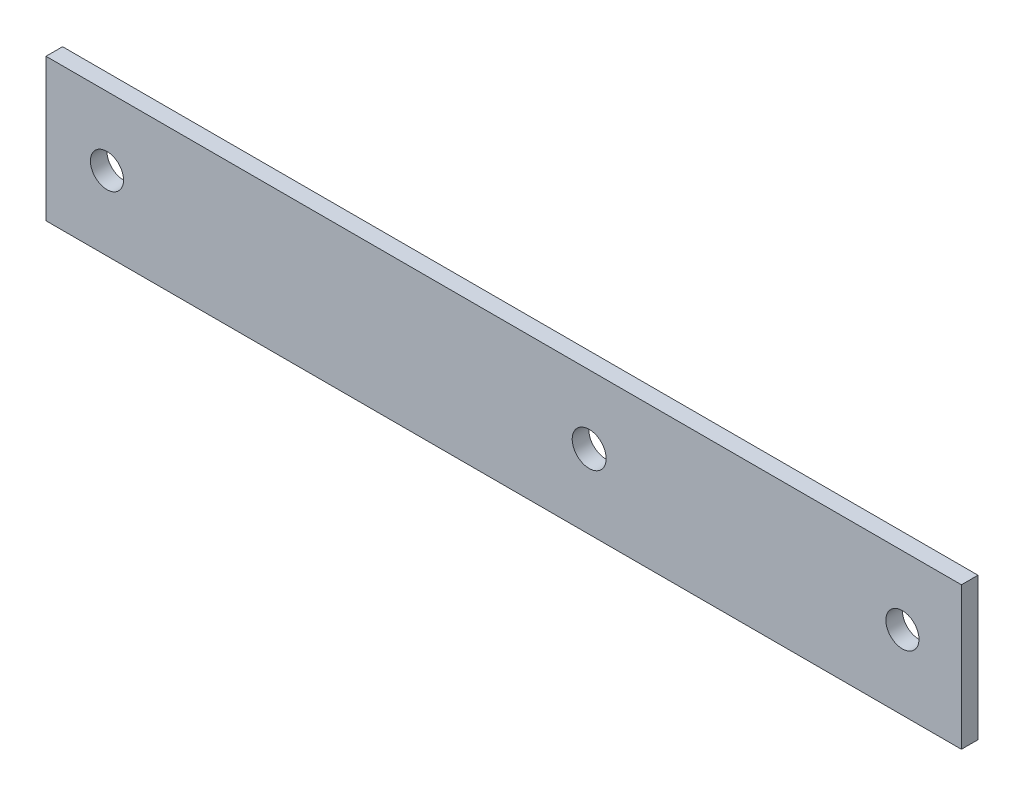
ISO-10303-21;
HEADER;
FILE_DESCRIPTION(('STEP AP214'),'2;1');
FILE_NAME('part.step','',(''),(''),'','','');
FILE_SCHEMA(('AUTOMOTIVE_DESIGN { 1 0 10303 214 1 1 1 1 }'));
ENDSEC;
DATA;
#1=APPLICATION_CONTEXT('core data for automotive mechanical design processes');
#2=APPLICATION_PROTOCOL_DEFINITION('international standard','automotive_design',2000,#1);
#3=PRODUCT_CONTEXT('',#1,'mechanical');
#4=PRODUCT('Part','Part','',(#3));
#5=PRODUCT_RELATED_PRODUCT_CATEGORY('part','',(#4));
#6=PRODUCT_DEFINITION_FORMATION('','',#4);
#7=PRODUCT_DEFINITION_CONTEXT('part definition',#1,'design');
#8=PRODUCT_DEFINITION('design','',#6,#7);
#9=PRODUCT_DEFINITION_SHAPE('','',#8);
#10=(LENGTH_UNIT() NAMED_UNIT(*) SI_UNIT(.MILLI.,.METRE.));
#11=(NAMED_UNIT(*) PLANE_ANGLE_UNIT() SI_UNIT($,.RADIAN.));
#12=(NAMED_UNIT(*) SI_UNIT($,.STERADIAN.) SOLID_ANGLE_UNIT());
#13=UNCERTAINTY_MEASURE_WITH_UNIT(LENGTH_MEASURE(1.E-05),#10,'distance_accuracy_value','');
#14=(GEOMETRIC_REPRESENTATION_CONTEXT(3) GLOBAL_UNCERTAINTY_ASSIGNED_CONTEXT((#13)) GLOBAL_UNIT_ASSIGNED_CONTEXT((#10,
#11,#12)) REPRESENTATION_CONTEXT('',''));
#15=CARTESIAN_POINT('',(0.,0.,0.));
#16=DIRECTION('',(0.,0.,1.));
#17=DIRECTION('',(1.,0.,0.));
#18=AXIS2_PLACEMENT_3D('',#15,#16,#17);
#19=CARTESIAN_POINT('',(0.,0.,3.175));
#20=DIRECTION('',(0.,0.,1.));
#21=DIRECTION('',(1.,0.,0.));
#22=AXIS2_PLACEMENT_3D('',#19,#20,#21);
#23=PLANE('',#22);
#24=CARTESIAN_POINT('',(228.6,-2.22044604925031E-13,3.175));
#25=DIRECTION('',(0.,0.,1.));
#26=DIRECTION('',(1.,0.,0.));
#27=AXIS2_PLACEMENT_3D('',#24,#25,#26);
#28=CIRCLE('',#27,3.175);
#29=CARTESIAN_POINT('',(231.775,-2.22044604925031E-13,3.175));
#30=VERTEX_POINT('',#29);
#31=EDGE_CURVE('E121',#30,#30,#28,.T.);
#32=ORIENTED_EDGE('',*,*,#31,.F.);
#33=EDGE_LOOP('',(#32));
#34=FACE_BOUND('',#33,.T.);
#35=DIRECTION('',(0.,-1.,0.));
#36=VECTOR('',#35,1.);
#37=CARTESIAN_POINT('',(64.5183783476568,13.1181038022383,3.175));
#38=LINE('',#37,#36);
#39=CARTESIAN_POINT('',(64.5183783476568,13.1181038022383,3.175));
#40=VERTEX_POINT('',#39);
#41=CARTESIAN_POINT('',(64.5183783476568,-14.1840582206214,3.175));
#42=VERTEX_POINT('',#41);
#43=EDGE_CURVE('E91',#40,#42,#38,.T.);
#44=ORIENTED_EDGE('',*,*,#43,.T.);
#45=DIRECTION('',(1.,0.,0.));
#46=VECTOR('',#45,1.);
#47=CARTESIAN_POINT('',(64.5183783476568,-14.1840582206214,3.175));
#48=LINE('',#47,#46);
#49=CARTESIAN_POINT('',(239.909083993808,-14.1840582206214,3.175));
#50=VERTEX_POINT('',#49);
#51=EDGE_CURVE('E86',#42,#50,#48,.T.);
#52=ORIENTED_EDGE('',*,*,#51,.T.);
#53=DIRECTION('',(0.,1.,0.));
#54=VECTOR('',#53,1.);
#55=CARTESIAN_POINT('',(239.909083993808,13.1181038022383,3.175));
#56=LINE('',#55,#54);
#57=CARTESIAN_POINT('',(239.909083993808,13.1181038022383,3.175));
#58=VERTEX_POINT('',#57);
#59=EDGE_CURVE('E89',#50,#58,#56,.T.);
#60=ORIENTED_EDGE('',*,*,#59,.T.);
#61=DIRECTION('',(-1.,0.,0.));
#62=VECTOR('',#61,1.);
#63=CARTESIAN_POINT('',(64.5183783476568,13.1181038022383,3.175));
#64=LINE('',#63,#62);
#65=EDGE_CURVE('E56',#58,#40,#64,.T.);
#66=ORIENTED_EDGE('',*,*,#65,.T.);
#67=EDGE_LOOP('',(#44,#52,#60,#66));
#68=FACE_BOUND('',#67,.T.);
#69=CARTESIAN_POINT('',(76.2,5.55111512312578E-13,3.175));
#70=DIRECTION('',(0.,0.,1.));
#71=DIRECTION('',(1.,0.,0.));
#72=AXIS2_PLACEMENT_3D('',#69,#70,#71);
#73=CIRCLE('',#72,3.175);
#74=CARTESIAN_POINT('',(79.375,5.55111512312578E-13,3.175));
#75=VERTEX_POINT('',#74);
#76=EDGE_CURVE('E106',#75,#75,#73,.T.);
#77=ORIENTED_EDGE('',*,*,#76,.F.);
#78=EDGE_LOOP('',(#77));
#79=FACE_BOUND('',#78,.T.);
#80=CARTESIAN_POINT('',(168.588523942262,0.,3.175));
#81=DIRECTION('',(0.,0.,1.));
#82=DIRECTION('',(1.,0.,0.));
#83=AXIS2_PLACEMENT_3D('',#80,#81,#82);
#84=CIRCLE('',#83,3.25120000000001);
#85=CARTESIAN_POINT('',(171.839723942262,0.,3.175));
#86=VERTEX_POINT('',#85);
#87=EDGE_CURVE('E127',#86,#86,#84,.T.);
#88=ORIENTED_EDGE('',*,*,#87,.F.);
#89=EDGE_LOOP('',(#88));
#90=FACE_BOUND('',#89,.T.);
#91=ADVANCED_FACE('F39',(#34,#68,#79,#90),#23,.T.);
#92=CARTESIAN_POINT('',(0.,0.,0.));
#93=DIRECTION('',(0.,0.,1.));
#94=DIRECTION('',(1.,0.,0.));
#95=AXIS2_PLACEMENT_3D('',#92,#93,#94);
#96=PLANE('',#95);
#97=DIRECTION('',(0.,-1.,0.));
#98=VECTOR('',#97,1.);
#99=CARTESIAN_POINT('',(64.5183783476568,13.1181038022383,0.));
#100=LINE('',#99,#98);
#101=CARTESIAN_POINT('',(64.5183783476568,13.1181038022383,0.));
#102=VERTEX_POINT('',#101);
#103=CARTESIAN_POINT('',(64.5183783476568,-14.1840582206214,0.));
#104=VERTEX_POINT('',#103);
#105=EDGE_CURVE('E103',#102,#104,#100,.T.);
#106=ORIENTED_EDGE('',*,*,#105,.F.);
#107=DIRECTION('',(-1.,0.,0.));
#108=VECTOR('',#107,1.);
#109=CARTESIAN_POINT('',(64.5183783476568,13.1181038022383,0.));
#110=LINE('',#109,#108);
#111=CARTESIAN_POINT('',(239.909083993808,13.1181038022383,0.));
#112=VERTEX_POINT('',#111);
#113=EDGE_CURVE('E79',#112,#102,#110,.T.);
#114=ORIENTED_EDGE('',*,*,#113,.F.);
#115=DIRECTION('',(0.,1.,0.));
#116=VECTOR('',#115,1.);
#117=CARTESIAN_POINT('',(239.909083993808,13.1181038022383,0.));
#118=LINE('',#117,#116);
#119=CARTESIAN_POINT('',(239.909083993808,-14.1840582206214,0.));
#120=VERTEX_POINT('',#119);
#121=EDGE_CURVE('E73',#120,#112,#118,.T.);
#122=ORIENTED_EDGE('',*,*,#121,.F.);
#123=DIRECTION('',(1.,0.,0.));
#124=VECTOR('',#123,1.);
#125=CARTESIAN_POINT('',(64.5183783476568,-14.1840582206214,0.));
#126=LINE('',#125,#124);
#127=EDGE_CURVE('E95',#104,#120,#126,.T.);
#128=ORIENTED_EDGE('',*,*,#127,.F.);
#129=EDGE_LOOP('',(#106,#114,#122,#128));
#130=FACE_BOUND('',#129,.T.);
#131=CARTESIAN_POINT('',(76.2,5.55111512312578E-13,0.));
#132=DIRECTION('',(0.,0.,1.));
#133=DIRECTION('',(1.,0.,0.));
#134=AXIS2_PLACEMENT_3D('',#131,#132,#133);
#135=CIRCLE('',#134,3.175);
#136=CARTESIAN_POINT('',(79.375,5.55111512312578E-13,0.));
#137=VERTEX_POINT('',#136);
#138=EDGE_CURVE('E118',#137,#137,#135,.T.);
#139=ORIENTED_EDGE('',*,*,#138,.T.);
#140=EDGE_LOOP('',(#139));
#141=FACE_BOUND('',#140,.T.);
#142=CARTESIAN_POINT('',(228.6,-2.22044604925031E-13,0.));
#143=DIRECTION('',(0.,0.,1.));
#144=DIRECTION('',(1.,0.,0.));
#145=AXIS2_PLACEMENT_3D('',#142,#143,#144);
#146=CIRCLE('',#145,3.175);
#147=CARTESIAN_POINT('',(231.775,-2.22044604925031E-13,0.));
#148=VERTEX_POINT('',#147);
#149=EDGE_CURVE('E124',#148,#148,#146,.T.);
#150=ORIENTED_EDGE('',*,*,#149,.T.);
#151=EDGE_LOOP('',(#150));
#152=FACE_BOUND('',#151,.T.);
#153=CARTESIAN_POINT('',(168.588523942262,0.,0.));
#154=DIRECTION('',(0.,0.,1.));
#155=DIRECTION('',(1.,0.,0.));
#156=AXIS2_PLACEMENT_3D('',#153,#154,#155);
#157=CIRCLE('',#156,3.25120000000001);
#158=CARTESIAN_POINT('',(171.839723942262,0.,0.));
#159=VERTEX_POINT('',#158);
#160=EDGE_CURVE('E130',#159,#159,#157,.T.);
#161=ORIENTED_EDGE('',*,*,#160,.T.);
#162=EDGE_LOOP('',(#161));
#163=FACE_BOUND('',#162,.T.);
#164=ADVANCED_FACE('F114',(#130,#141,#152,#163),#96,.F.);
#165=CARTESIAN_POINT('',(64.5183783476568,13.1181038022383,3.175));
#166=DIRECTION('',(1.,0.,0.));
#167=DIRECTION('',(0.,0.,-1.));
#168=AXIS2_PLACEMENT_3D('',#165,#166,#167);
#169=PLANE('',#168);
#170=ORIENTED_EDGE('',*,*,#105,.T.);
#171=DIRECTION('',(0.,0.,-1.));
#172=VECTOR('',#171,1.);
#173=CARTESIAN_POINT('',(64.5183783476568,-14.1840582206214,3.175));
#174=LINE('',#173,#172);
#175=EDGE_CURVE('E11',#42,#104,#174,.T.);
#176=ORIENTED_EDGE('',*,*,#175,.F.);
#177=ORIENTED_EDGE('',*,*,#43,.F.);
#178=DIRECTION('',(0.,0.,-1.));
#179=VECTOR('',#178,1.);
#180=CARTESIAN_POINT('',(64.5183783476568,13.1181038022383,3.175));
#181=LINE('',#180,#179);
#182=EDGE_CURVE('E99',#40,#102,#181,.T.);
#183=ORIENTED_EDGE('',*,*,#182,.T.);
#184=EDGE_LOOP('',(#170,#176,#177,#183));
#185=FACE_BOUND('',#184,.T.);
#186=ADVANCED_FACE('F41',(#185),#169,.F.);
#187=CARTESIAN_POINT('',(64.5183783476568,-14.1840582206214,3.175));
#188=DIRECTION('',(0.,1.,0.));
#189=DIRECTION('',(0.,0.,1.));
#190=AXIS2_PLACEMENT_3D('',#187,#188,#189);
#191=PLANE('',#190);
#192=ORIENTED_EDGE('',*,*,#127,.T.);
#193=DIRECTION('',(0.,0.,-1.));
#194=VECTOR('',#193,1.);
#195=CARTESIAN_POINT('',(239.909083993808,-14.1840582206214,3.175));
#196=LINE('',#195,#194);
#197=EDGE_CURVE('E48',#50,#120,#196,.T.);
#198=ORIENTED_EDGE('',*,*,#197,.F.);
#199=ORIENTED_EDGE('',*,*,#51,.F.);
#200=ORIENTED_EDGE('',*,*,#175,.T.);
#201=EDGE_LOOP('',(#192,#198,#199,#200));
#202=FACE_BOUND('',#201,.T.);
#203=ADVANCED_FACE('F94',(#202),#191,.F.);
#204=CARTESIAN_POINT('',(239.909083993808,13.1181038022383,3.175));
#205=DIRECTION('',(-1.,0.,0.));
#206=DIRECTION('',(0.,0.,1.));
#207=AXIS2_PLACEMENT_3D('',#204,#205,#206);
#208=PLANE('',#207);
#209=ORIENTED_EDGE('',*,*,#121,.T.);
#210=DIRECTION('',(0.,0.,-1.));
#211=VECTOR('',#210,1.);
#212=CARTESIAN_POINT('',(239.909083993808,13.1181038022383,3.175));
#213=LINE('',#212,#211);
#214=EDGE_CURVE('E96',#58,#112,#213,.T.);
#215=ORIENTED_EDGE('',*,*,#214,.F.);
#216=ORIENTED_EDGE('',*,*,#59,.F.);
#217=ORIENTED_EDGE('',*,*,#197,.T.);
#218=EDGE_LOOP('',(#209,#215,#216,#217));
#219=FACE_BOUND('',#218,.T.);
#220=ADVANCED_FACE('F97',(#219),#208,.F.);
#221=CARTESIAN_POINT('',(64.5183783476568,13.1181038022383,3.175));
#222=DIRECTION('',(0.,-1.,0.));
#223=DIRECTION('',(0.,0.,-1.));
#224=AXIS2_PLACEMENT_3D('',#221,#222,#223);
#225=PLANE('',#224);
#226=ORIENTED_EDGE('',*,*,#113,.T.);
#227=ORIENTED_EDGE('',*,*,#182,.F.);
#228=ORIENTED_EDGE('',*,*,#65,.F.);
#229=ORIENTED_EDGE('',*,*,#214,.T.);
#230=EDGE_LOOP('',(#226,#227,#228,#229));
#231=FACE_BOUND('',#230,.T.);
#232=ADVANCED_FACE('F111',(#231),#225,.F.);
#233=CARTESIAN_POINT('',(76.2,5.55111512312578E-13,3.175));
#234=DIRECTION('',(0.,0.,-1.));
#235=DIRECTION('',(-1.,0.,0.));
#236=AXIS2_PLACEMENT_3D('',#233,#234,#235);
#237=CYLINDRICAL_SURFACE('',#236,3.175);
#238=ORIENTED_EDGE('',*,*,#76,.T.);
#239=EDGE_LOOP('',(#238));
#240=FACE_BOUND('',#239,.T.);
#241=ORIENTED_EDGE('',*,*,#138,.F.);
#242=EDGE_LOOP('',(#241));
#243=FACE_BOUND('',#242,.T.);
#244=ADVANCED_FACE('F148',(#240,#243),#237,.F.);
#245=CARTESIAN_POINT('',(228.6,-2.22044604925031E-13,3.175));
#246=DIRECTION('',(0.,0.,-1.));
#247=DIRECTION('',(-1.,0.,0.));
#248=AXIS2_PLACEMENT_3D('',#245,#246,#247);
#249=CYLINDRICAL_SURFACE('',#248,3.175);
#250=ORIENTED_EDGE('',*,*,#31,.T.);
#251=EDGE_LOOP('',(#250));
#252=FACE_BOUND('',#251,.T.);
#253=ORIENTED_EDGE('',*,*,#149,.F.);
#254=EDGE_LOOP('',(#253));
#255=FACE_BOUND('',#254,.T.);
#256=ADVANCED_FACE('F193',(#252,#255),#249,.F.);
#257=CARTESIAN_POINT('',(168.588523942262,0.,3.175));
#258=DIRECTION('',(0.,0.,-1.));
#259=DIRECTION('',(-1.,0.,0.));
#260=AXIS2_PLACEMENT_3D('',#257,#258,#259);
#261=CYLINDRICAL_SURFACE('',#260,3.25120000000001);
#262=ORIENTED_EDGE('',*,*,#87,.T.);
#263=EDGE_LOOP('',(#262));
#264=FACE_BOUND('',#263,.T.);
#265=ORIENTED_EDGE('',*,*,#160,.F.);
#266=EDGE_LOOP('',(#265));
#267=FACE_BOUND('',#266,.T.);
#268=ADVANCED_FACE('F136',(#264,#267),#261,.F.);
#269=CLOSED_SHELL('',(#91,#164,#186,#203,#220,#232,#244,#256,#268));
#270=MANIFOLD_SOLID_BREP('B2',#269);
#271=ADVANCED_BREP_SHAPE_REPRESENTATION('',(#18,#270),#14);
#272=SHAPE_DEFINITION_REPRESENTATION(#9,#271);
ENDSEC;
END-ISO-10303-21;
